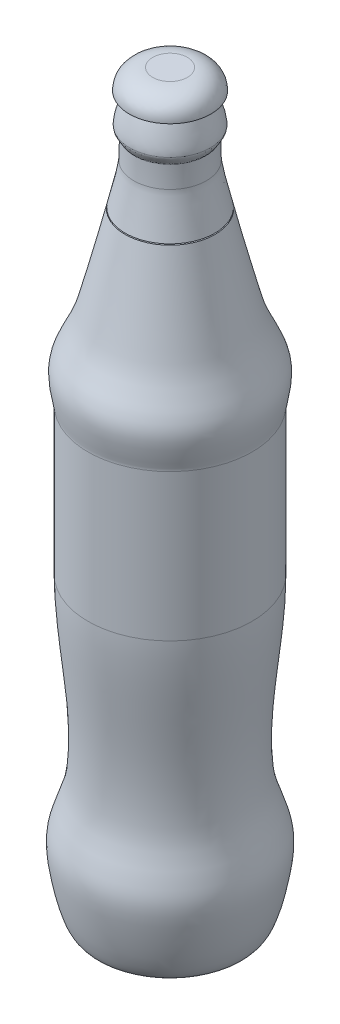
ISO-10303-21;
HEADER;
FILE_DESCRIPTION(('STEP AP214'),'2;1');
FILE_NAME('part.step','',(''),(''),'','','');
FILE_SCHEMA(('AUTOMOTIVE_DESIGN { 1 0 10303 214 1 1 1 1 }'));
ENDSEC;
DATA;
#1=APPLICATION_CONTEXT('core data for automotive mechanical design processes');
#2=APPLICATION_PROTOCOL_DEFINITION('international standard','automotive_design',2000,#1);
#3=PRODUCT_CONTEXT('',#1,'mechanical');
#4=PRODUCT('Part','Part','',(#3));
#5=PRODUCT_RELATED_PRODUCT_CATEGORY('part','',(#4));
#6=PRODUCT_DEFINITION_FORMATION('','',#4);
#7=PRODUCT_DEFINITION_CONTEXT('part definition',#1,'design');
#8=PRODUCT_DEFINITION('design','',#6,#7);
#9=PRODUCT_DEFINITION_SHAPE('','',#8);
#10=(LENGTH_UNIT() NAMED_UNIT(*) SI_UNIT(.MILLI.,.METRE.));
#11=(NAMED_UNIT(*) PLANE_ANGLE_UNIT() SI_UNIT($,.RADIAN.));
#12=(NAMED_UNIT(*) SI_UNIT($,.STERADIAN.) SOLID_ANGLE_UNIT());
#13=UNCERTAINTY_MEASURE_WITH_UNIT(LENGTH_MEASURE(1.E-05),#10,'distance_accuracy_value','');
#14=(GEOMETRIC_REPRESENTATION_CONTEXT(3) GLOBAL_UNCERTAINTY_ASSIGNED_CONTEXT((#13)) GLOBAL_UNIT_ASSIGNED_CONTEXT((#10,
#11,#12)) REPRESENTATION_CONTEXT('',''));
#15=CARTESIAN_POINT('',(0.,0.,0.));
#16=DIRECTION('',(0.,0.,1.));
#17=DIRECTION('',(1.,0.,0.));
#18=AXIS2_PLACEMENT_3D('',#15,#16,#17);
#19=CARTESIAN_POINT('',(66.4192807318606,70.155831459885,0.));
#20=CARTESIAN_POINT('',(66.3692692934347,69.1226417661659,0.));
#21=CARTESIAN_POINT('',(63.8742488392106,58.8856125662851,0.));
#22=CARTESIAN_POINT('',(62.7834772218491,55.0896582093176,0.));
#23=CARTESIAN_POINT('',(61.7728565797807,53.2403121775324,0.));
#24=CARTESIAN_POINT('',(60.8598563140987,50.8213003783311,0.));
#25=CARTESIAN_POINT('',(61.601817140569,48.1568115838373,0.));
#26=CARTESIAN_POINT('',(61.601817140569,47.8385554237025,0.));
#27=B_SPLINE_CURVE_WITH_KNOTS('',3,(#19,#20,#21,#22,#23,#24,#25,#26),.UNSPECIFIED.,.F.,.F.,(4,1,
1,1,1,4),(0.,0.437739957428358,0.506404201194314,0.686642437659559,0.813070162776564,1.),.UNSPECIFIED.);
#28=CARTESIAN_POINT('',(70.2369282003699,0.72855248004856,0.));
#29=DIRECTION('',(0.,-1.,0.));
#30=AXIS1_PLACEMENT('',#28,#29);
#31=SURFACE_OF_REVOLUTION('',#27,#30);
#32=CARTESIAN_POINT('',(70.2369282003699,70.155831459885,0.));
#33=DIRECTION('',(0.,-1.,0.));
#34=DIRECTION('',(0.,0.,-1.));
#35=AXIS2_PLACEMENT_3D('',#32,#33,#34);
#36=CIRCLE('',#35,3.81764746850935);
#37=CARTESIAN_POINT('',(70.2369282003699,70.155831459885,-3.81764746850935));
#38=VERTEX_POINT('',#37);
#39=EDGE_CURVE('E72',#38,#38,#36,.T.);
#40=ORIENTED_EDGE('',*,*,#39,.T.);
#41=EDGE_LOOP('',(#40));
#42=FACE_BOUND('',#41,.T.);
#43=CARTESIAN_POINT('',(70.2369282003699,65.8285524800486,0.));
#44=DIRECTION('',(0.,-1.,0.));
#45=DIRECTION('',(0.,0.,-1.));
#46=AXIS2_PLACEMENT_3D('',#43,#44,#45);
#47=CIRCLE('',#46,4.71786227616042);
#48=CARTESIAN_POINT('',(70.2369282003699,65.8285524800486,-4.71786227616042));
#49=VERTEX_POINT('',#48);
#50=EDGE_CURVE('E11',#49,#49,#47,.T.);
#51=ORIENTED_EDGE('',*,*,#50,.F.);
#52=EDGE_LOOP('',(#51));
#53=FACE_BOUND('',#52,.T.);
#54=ADVANCED_FACE('F51',(#42,#53),#31,.T.);
#55=CARTESIAN_POINT('',(68.4094680232462,78.5883370767875,0.));
#56=DIRECTION('',(0.,-1.,0.));
#57=DIRECTION('',(0.,0.,-1.));
#58=AXIS2_PLACEMENT_3D('',#55,#56,#57);
#59=PLANE('',#58);
#60=CARTESIAN_POINT('',(70.2369282003699,78.5883370767875,0.));
#61=DIRECTION('',(0.,-1.,0.));
#62=DIRECTION('',(0.,0.,-1.));
#63=AXIS2_PLACEMENT_3D('',#60,#61,#62);
#64=CIRCLE('',#63,1.82746017712372);
#65=CARTESIAN_POINT('',(70.2369282003699,78.5883370767875,-1.82746017712372));
#66=VERTEX_POINT('',#65);
#67=EDGE_CURVE('E68',#66,#66,#64,.T.);
#68=ORIENTED_EDGE('',*,*,#67,.F.);
#69=EDGE_LOOP('',(#68));
#70=FACE_BOUND('',#69,.T.);
#71=ADVANCED_FACE('F105',(#70),#59,.F.);
#72=CARTESIAN_POINT('',(68.4094680232462,78.5883370767875,0.));
#73=CARTESIAN_POINT('',(67.1552839184113,78.5883370767875,0.));
#74=CARTESIAN_POINT('',(65.9492629339348,77.8519844063791,0.));
#75=CARTESIAN_POINT('',(65.9492629339347,76.4714046443598,0.));
#76=B_SPLINE_CURVE_WITH_KNOTS('',3,(#72,#73,#74,#75),.UNSPECIFIED.,.F.,.F.,(4,4),(0.,1.),.UNSPECIFIED.);
#77=CARTESIAN_POINT('',(70.2369282003699,0.72855248004856,0.));
#78=DIRECTION('',(0.,-1.,0.));
#79=AXIS1_PLACEMENT('',#77,#78);
#80=SURFACE_OF_REVOLUTION('',#76,#79);
#81=CARTESIAN_POINT('',(70.2369282003699,76.4714046443598,0.));
#82=DIRECTION('',(0.,-1.,0.));
#83=DIRECTION('',(0.,0.,-1.));
#84=AXIS2_PLACEMENT_3D('',#81,#82,#83);
#85=CIRCLE('',#84,4.2876652664352);
#86=CARTESIAN_POINT('',(70.2369282003699,76.4714046443598,-4.2876652664352));
#87=VERTEX_POINT('',#86);
#88=EDGE_CURVE('E71',#87,#87,#85,.T.);
#89=ORIENTED_EDGE('',*,*,#88,.F.);
#90=EDGE_LOOP('',(#89));
#91=FACE_BOUND('',#90,.T.);
#92=ORIENTED_EDGE('',*,*,#67,.T.);
#93=EDGE_LOOP('',(#92));
#94=FACE_BOUND('',#93,.T.);
#95=ADVANCED_FACE('F110',(#91,#94),#80,.T.);
#96=CARTESIAN_POINT('',(65.9492629339347,76.4714046443598,0.));
#97=DIRECTION('',(0.,1.,0.));
#98=DIRECTION('',(0.,0.,1.));
#99=AXIS2_PLACEMENT_3D('',#96,#97,#98);
#100=PLANE('',#99);
#101=CARTESIAN_POINT('',(70.2369282003699,76.4714046443598,0.));
#102=DIRECTION('',(0.,-1.,0.));
#103=DIRECTION('',(0.,0.,-1.));
#104=AXIS2_PLACEMENT_3D('',#101,#102,#103);
#105=CIRCLE('',#104,3.39744616580165);
#106=CARTESIAN_POINT('',(70.2369282003699,76.4714046443598,-3.39744616580165));
#107=VERTEX_POINT('',#106);
#108=EDGE_CURVE('E75',#107,#107,#105,.T.);
#109=ORIENTED_EDGE('',*,*,#108,.F.);
#110=EDGE_LOOP('',(#109));
#111=FACE_BOUND('',#110,.T.);
#112=ORIENTED_EDGE('',*,*,#88,.T.);
#113=EDGE_LOOP('',(#112));
#114=FACE_BOUND('',#113,.T.);
#115=ADVANCED_FACE('F125',(#111,#114),#100,.F.);
#116=CARTESIAN_POINT('',(66.8394820345683,76.4714046443598,0.));
#117=CARTESIAN_POINT('',(65.9996473431409,74.1970743786341,0.));
#118=CARTESIAN_POINT('',(65.9996473431409,73.3703067199292,0.));
#119=B_SPLINE_CURVE_WITH_KNOTS('',2,(#116,#117,#118),.UNSPECIFIED.,.F.,.F.,(3,3),(0.,1.),.UNSPECIFIED.);
#120=CARTESIAN_POINT('',(70.2369282003699,0.72855248004856,0.));
#121=DIRECTION('',(0.,-1.,0.));
#122=AXIS1_PLACEMENT('',#120,#121);
#123=SURFACE_OF_REVOLUTION('',#119,#122);
#124=CARTESIAN_POINT('',(70.2369282003699,73.3703067199292,0.));
#125=DIRECTION('',(0.,-1.,0.));
#126=DIRECTION('',(0.,0.,-1.));
#127=AXIS2_PLACEMENT_3D('',#124,#125,#126);
#128=CIRCLE('',#127,4.23728085722903);
#129=CARTESIAN_POINT('',(70.2369282003699,73.3703067199292,-4.23728085722903));
#130=VERTEX_POINT('',#129);
#131=EDGE_CURVE('E65',#130,#130,#128,.T.);
#132=ORIENTED_EDGE('',*,*,#131,.F.);
#133=EDGE_LOOP('',(#132));
#134=FACE_BOUND('',#133,.T.);
#135=ORIENTED_EDGE('',*,*,#108,.T.);
#136=EDGE_LOOP('',(#135));
#137=FACE_BOUND('',#136,.T.);
#138=ADVANCED_FACE('F120',(#134,#137),#123,.T.);
#139=CARTESIAN_POINT('',(65.9996473431409,73.3703067199292,0.));
#140=CARTESIAN_POINT('',(65.9996473431409,73.0590923032667,0.));
#141=CARTESIAN_POINT('',(66.4763712833562,72.5292633260498,0.));
#142=CARTESIAN_POINT('',(66.4763712833562,72.4020191366919,0.));
#143=B_SPLINE_CURVE_WITH_KNOTS('',3,(#139,#140,#141,#142),.UNSPECIFIED.,.F.,.F.,(4,4),(0.,1.),.UNSPECIFIED.);
#144=CARTESIAN_POINT('',(70.2369282003699,0.72855248004856,0.));
#145=DIRECTION('',(0.,-1.,0.));
#146=AXIS1_PLACEMENT('',#144,#145);
#147=SURFACE_OF_REVOLUTION('',#143,#146);
#148=CARTESIAN_POINT('',(70.2369282003699,72.4020191366919,0.));
#149=DIRECTION('',(0.,-1.,0.));
#150=DIRECTION('',(0.,0.,-1.));
#151=AXIS2_PLACEMENT_3D('',#148,#149,#150);
#152=CIRCLE('',#151,3.76055691701374);
#153=CARTESIAN_POINT('',(70.2369282003699,72.4020191366919,-3.76055691701374));
#154=VERTEX_POINT('',#153);
#155=EDGE_CURVE('E60',#154,#154,#152,.T.);
#156=ORIENTED_EDGE('',*,*,#155,.F.);
#157=EDGE_LOOP('',(#156));
#158=FACE_BOUND('',#157,.T.);
#159=ORIENTED_EDGE('',*,*,#131,.T.);
#160=EDGE_LOOP('',(#159));
#161=FACE_BOUND('',#160,.T.);
#162=ADVANCED_FACE('F98',(#158,#161),#147,.T.);
#163=CARTESIAN_POINT('',(66.4763712833562,72.4020191366919,0.));
#164=CARTESIAN_POINT('',(66.4763712833562,71.6981381839218,0.));
#165=CARTESIAN_POINT('',(66.4571779745356,70.9387531630903,0.));
#166=CARTESIAN_POINT('',(66.4192807318606,70.155831459885,0.));
#167=B_SPLINE_CURVE_WITH_KNOTS('',3,(#163,#164,#165,#166),.UNSPECIFIED.,.F.,.F.,(4,4),(0.,
0.0750544941033932),.UNSPECIFIED.);
#168=CARTESIAN_POINT('',(70.2369282003699,0.72855248004856,0.));
#169=DIRECTION('',(0.,-1.,0.));
#170=AXIS1_PLACEMENT('',#168,#169);
#171=SURFACE_OF_REVOLUTION('',#167,#170);
#172=ORIENTED_EDGE('',*,*,#39,.F.);
#173=EDGE_LOOP('',(#172));
#174=FACE_BOUND('',#173,.T.);
#175=ORIENTED_EDGE('',*,*,#155,.T.);
#176=EDGE_LOOP('',(#175));
#177=FACE_BOUND('',#176,.T.);
#178=ADVANCED_FACE('F94',(#174,#177),#171,.T.);
#179=CARTESIAN_POINT('',(70.2369282003699,65.8285524800486,0.));
#180=DIRECTION('',(0.,-1.,0.));
#181=DIRECTION('',(0.,0.,-1.));
#182=AXIS2_PLACEMENT_3D('',#179,#180,#181);
#183=PLANE('',#182);
#184=ORIENTED_EDGE('',*,*,#50,.T.);
#185=EDGE_LOOP('',(#184));
#186=FACE_BOUND('',#185,.T.);
#187=ADVANCED_FACE('F97',(#186),#183,.T.);
#188=CLOSED_SHELL('',(#54,#71,#95,#115,#138,#162,#178,#187));
#189=MANIFOLD_SOLID_BREP('B2',#188);
#190=CARTESIAN_POINT('',(63.0494969815829,0.728552480048558,0.));
#191=DIRECTION('',(0.,1.,0.));
#192=DIRECTION('',(0.,0.,1.));
#193=AXIS2_PLACEMENT_3D('',#190,#191,#192);
#194=PLANE('',#193);
#195=CARTESIAN_POINT('',(70.2369282003699,0.728552480048558,0.));
#196=DIRECTION('',(0.,-1.,0.));
#197=DIRECTION('',(0.,0.,-1.));
#198=AXIS2_PLACEMENT_3D('',#195,#196,#197);
#199=CIRCLE('',#198,0.499999999999999);
#200=CARTESIAN_POINT('',(70.2369282003699,0.728552480048558,-0.499999999999999));
#201=VERTEX_POINT('',#200);
#202=EDGE_CURVE('E294',#201,#201,#199,.T.);
#203=ORIENTED_EDGE('',*,*,#202,.F.);
#204=EDGE_LOOP('',(#203));
#205=FACE_BOUND('',#204,.T.);
#206=CARTESIAN_POINT('',(70.2369282003699,0.728552480048557,0.));
#207=DIRECTION('',(0.,-1.,0.));
#208=DIRECTION('',(0.,0.,-1.));
#209=AXIS2_PLACEMENT_3D('',#206,#207,#208);
#210=CIRCLE('',#209,7.18743121878704);
#211=CARTESIAN_POINT('',(70.2369282003699,0.728552480048557,-7.18743121878704));
#212=VERTEX_POINT('',#211);
#213=EDGE_CURVE('E50',#212,#212,#210,.T.);
#214=ORIENTED_EDGE('',*,*,#213,.T.);
#215=EDGE_LOOP('',(#214));
#216=FACE_BOUND('',#215,.T.);
#217=ADVANCED_FACE('F250',(#205,#216),#194,.F.);
#218=CARTESIAN_POINT('',(61.601817140569,32.4020720848778,0.));
#219=CARTESIAN_POINT('',(61.601817140569,26.9833005130404,0.));
#220=CARTESIAN_POINT('',(63.1796987113747,20.2486457886248,0.));
#221=CARTESIAN_POINT('',(62.333477371274,12.3880678654202,0.));
#222=CARTESIAN_POINT('',(60.8382005923775,9.37102992177772,0.));
#223=CARTESIAN_POINT('',(61.1948873803578,5.34937302799525,0.));
#224=CARTESIAN_POINT('',(62.2804653216127,0.728552480048557,0.));
#225=CARTESIAN_POINT('',(63.0494969815829,0.728552480048557,0.));
#226=B_SPLINE_CURVE_WITH_KNOTS('',3,(#218,#219,#220,#221,#222,#223,#224,#225),.UNSPECIFIED.,.F.,
.F.,(4,1,1,1,1,4),(0.,0.524678210436975,0.598156050827865,0.732198724472395,0.815445745815693,
1.),.UNSPECIFIED.);
#227=CARTESIAN_POINT('',(70.2369282003699,0.72855248004856,0.));
#228=DIRECTION('',(0.,-1.,0.));
#229=AXIS1_PLACEMENT('',#227,#228);
#230=SURFACE_OF_REVOLUTION('',#226,#229);
#231=ORIENTED_EDGE('',*,*,#213,.F.);
#232=EDGE_LOOP('',(#231));
#233=FACE_BOUND('',#232,.T.);
#234=CARTESIAN_POINT('',(70.2369282003699,32.4020720848778,0.));
#235=DIRECTION('',(0.,-1.,0.));
#236=DIRECTION('',(0.,0.,-1.));
#237=AXIS2_PLACEMENT_3D('',#234,#235,#236);
#238=CIRCLE('',#237,8.63511105980097);
#239=CARTESIAN_POINT('',(70.2369282003699,32.4020720848778,-8.63511105980097));
#240=VERTEX_POINT('',#239);
#241=EDGE_CURVE('E263',#240,#240,#238,.T.);
#242=ORIENTED_EDGE('',*,*,#241,.T.);
#243=EDGE_LOOP('',(#242));
#244=FACE_BOUND('',#243,.T.);
#245=ADVANCED_FACE('F252',(#233,#244),#230,.T.);
#246=CARTESIAN_POINT('',(70.2369282003699,0.72855248004856,0.));
#247=DIRECTION('',(0.,-1.,0.));
#248=DIRECTION('',(0.,0.,-1.));
#249=AXIS2_PLACEMENT_3D('',#246,#247,#248);
#250=CYLINDRICAL_SURFACE('',#249,8.63511105980097);
#251=ORIENTED_EDGE('',*,*,#241,.F.);
#252=EDGE_LOOP('',(#251));
#253=FACE_BOUND('',#252,.T.);
#254=CARTESIAN_POINT('',(70.2369282003699,47.8385554237025,0.));
#255=DIRECTION('',(0.,-1.,0.));
#256=DIRECTION('',(0.,0.,-1.));
#257=AXIS2_PLACEMENT_3D('',#254,#255,#256);
#258=CIRCLE('',#257,8.63511105980097);
#259=CARTESIAN_POINT('',(70.2369282003699,47.8385554237025,-8.63511105980097));
#260=VERTEX_POINT('',#259);
#261=EDGE_CURVE('E259',#260,#260,#258,.T.);
#262=ORIENTED_EDGE('',*,*,#261,.T.);
#263=EDGE_LOOP('',(#262));
#264=FACE_BOUND('',#263,.T.);
#265=ADVANCED_FACE('F283',(#253,#264),#250,.T.);
#266=CARTESIAN_POINT('',(66.4192807318606,70.155831459885,0.));
#267=CARTESIAN_POINT('',(66.3692692934347,69.1226417661659,0.));
#268=CARTESIAN_POINT('',(63.8742488392106,58.8856125662851,0.));
#269=CARTESIAN_POINT('',(62.7834772218491,55.0896582093176,0.));
#270=CARTESIAN_POINT('',(61.7728565797807,53.2403121775324,0.));
#271=CARTESIAN_POINT('',(60.8598563140987,50.8213003783311,0.));
#272=CARTESIAN_POINT('',(61.601817140569,48.1568115838373,0.));
#273=CARTESIAN_POINT('',(61.601817140569,47.8385554237025,0.));
#274=B_SPLINE_CURVE_WITH_KNOTS('',3,(#266,#267,#268,#269,#270,#271,#272,#273),.UNSPECIFIED.,.F.,
.F.,(4,1,1,1,1,4),(0.,0.437739957428358,0.506404201194314,0.686642437659559,0.813070162776564,
1.),.UNSPECIFIED.);
#275=CARTESIAN_POINT('',(70.2369282003699,0.72855248004856,0.));
#276=DIRECTION('',(0.,-1.,0.));
#277=AXIS1_PLACEMENT('',#275,#276);
#278=SURFACE_OF_REVOLUTION('',#274,#277);
#279=CARTESIAN_POINT('',(70.2369282003699,65.7285524800486,0.));
#280=DIRECTION('',(0.,-1.,0.));
#281=DIRECTION('',(0.,0.,-1.));
#282=AXIS2_PLACEMENT_3D('',#279,#280,#281);
#283=CIRCLE('',#282,4.74121598313246);
#284=CARTESIAN_POINT('',(70.2369282003699,65.7285524800486,-4.74121598313246));
#285=VERTEX_POINT('',#284);
#286=EDGE_CURVE('E255',#285,#285,#283,.T.);
#287=ORIENTED_EDGE('',*,*,#286,.T.);
#288=EDGE_LOOP('',(#287));
#289=FACE_BOUND('',#288,.T.);
#290=ORIENTED_EDGE('',*,*,#261,.F.);
#291=EDGE_LOOP('',(#290));
#292=FACE_BOUND('',#291,.T.);
#293=ADVANCED_FACE('F279',(#289,#292),#278,.T.);
#294=CARTESIAN_POINT('',(70.2369282003699,65.7285524800486,0.));
#295=DIRECTION('',(0.,-1.,0.));
#296=DIRECTION('',(0.,0.,-1.));
#297=AXIS2_PLACEMENT_3D('',#294,#295,#296);
#298=PLANE('',#297);
#299=ORIENTED_EDGE('',*,*,#286,.F.);
#300=EDGE_LOOP('',(#299));
#301=FACE_BOUND('',#300,.T.);
#302=ADVANCED_FACE('F282',(#301),#298,.F.);
#303=CARTESIAN_POINT('',(70.2369282003699,1.12855248004856,0.));
#304=DIRECTION('',(0.,-1.,0.));
#305=DIRECTION('',(0.,0.,-1.));
#306=AXIS2_PLACEMENT_3D('',#303,#304,#305);
#307=CYLINDRICAL_SURFACE('',#306,0.499999999999999);
#308=CARTESIAN_POINT('',(70.2369282003699,1.12855248004856,0.));
#309=DIRECTION('',(0.,-1.,0.));
#310=DIRECTION('',(0.,0.,-1.));
#311=AXIS2_PLACEMENT_3D('',#308,#309,#310);
#312=CIRCLE('',#311,0.499999999999999);
#313=CARTESIAN_POINT('',(70.2369282003699,1.12855248004856,-0.499999999999999));
#314=VERTEX_POINT('',#313);
#315=EDGE_CURVE('E296',#314,#314,#312,.T.);
#316=ORIENTED_EDGE('',*,*,#315,.F.);
#317=EDGE_LOOP('',(#316));
#318=FACE_BOUND('',#317,.T.);
#319=ORIENTED_EDGE('',*,*,#202,.T.);
#320=EDGE_LOOP('',(#319));
#321=FACE_BOUND('',#320,.T.);
#322=ADVANCED_FACE('F306',(#318,#321),#307,.F.);
#323=CARTESIAN_POINT('',(70.2369282003699,1.12855248004856,0.));
#324=DIRECTION('',(0.,-1.,0.));
#325=DIRECTION('',(0.,0.,-1.));
#326=AXIS2_PLACEMENT_3D('',#323,#324,#325);
#327=PLANE('',#326);
#328=ORIENTED_EDGE('',*,*,#315,.T.);
#329=EDGE_LOOP('',(#328));
#330=FACE_BOUND('',#329,.T.);
#331=ADVANCED_FACE('F310',(#330),#327,.T.);
#332=CLOSED_SHELL('',(#217,#245,#265,#293,#302,#322,#331));
#333=MANIFOLD_SOLID_BREP('B6',#332);
#334=ADVANCED_BREP_SHAPE_REPRESENTATION('',(#18,#189,#333),#14);
#335=SHAPE_DEFINITION_REPRESENTATION(#9,#334);
ENDSEC;
END-ISO-10303-21;
